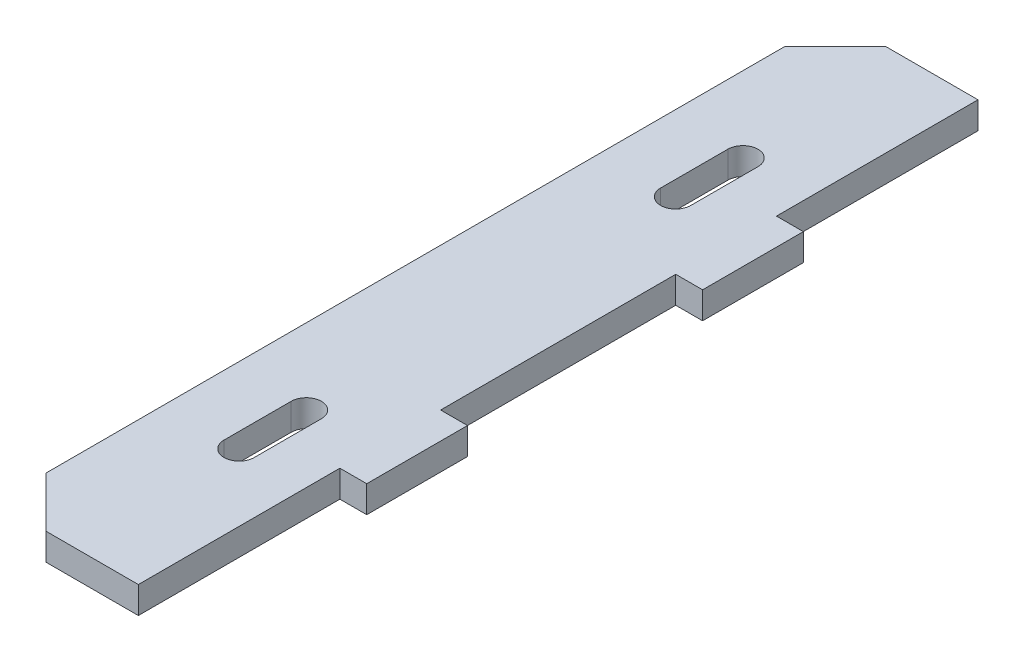
ISO-10303-21;
HEADER;
FILE_DESCRIPTION(('STEP AP214'),'2;1');
FILE_NAME('part.step','',(''),(''),'','','');
FILE_SCHEMA(('AUTOMOTIVE_DESIGN { 1 0 10303 214 1 1 1 1 }'));
ENDSEC;
DATA;
#1=APPLICATION_CONTEXT('core data for automotive mechanical design processes');
#2=APPLICATION_PROTOCOL_DEFINITION('international standard','automotive_design',2000,#1);
#3=PRODUCT_CONTEXT('',#1,'mechanical');
#4=PRODUCT('Part','Part','',(#3));
#5=PRODUCT_RELATED_PRODUCT_CATEGORY('part','',(#4));
#6=PRODUCT_DEFINITION_FORMATION('','',#4);
#7=PRODUCT_DEFINITION_CONTEXT('part definition',#1,'design');
#8=PRODUCT_DEFINITION('design','',#6,#7);
#9=PRODUCT_DEFINITION_SHAPE('','',#8);
#10=(LENGTH_UNIT() NAMED_UNIT(*) SI_UNIT(.MILLI.,.METRE.));
#11=(NAMED_UNIT(*) PLANE_ANGLE_UNIT() SI_UNIT($,.RADIAN.));
#12=(NAMED_UNIT(*) SI_UNIT($,.STERADIAN.) SOLID_ANGLE_UNIT());
#13=UNCERTAINTY_MEASURE_WITH_UNIT(LENGTH_MEASURE(1.E-05),#10,'distance_accuracy_value','');
#14=(GEOMETRIC_REPRESENTATION_CONTEXT(3) GLOBAL_UNCERTAINTY_ASSIGNED_CONTEXT((#13)) GLOBAL_UNIT_ASSIGNED_CONTEXT((#10,
#11,#12)) REPRESENTATION_CONTEXT('',''));
#15=CARTESIAN_POINT('',(0.,0.,0.));
#16=DIRECTION('',(0.,0.,1.));
#17=DIRECTION('',(1.,0.,0.));
#18=AXIS2_PLACEMENT_3D('',#15,#16,#17);
#19=CARTESIAN_POINT('',(-385.,49.5,125.));
#20=DIRECTION('',(0.,0.,-1.));
#21=DIRECTION('',(1.,0.,0.));
#22=AXIS2_PLACEMENT_3D('',#19,#20,#21);
#23=PLANE('',#22);
#24=DIRECTION('',(1.,0.,0.));
#25=VECTOR('',#24,1.);
#26=CARTESIAN_POINT('',(-385.,41.5,125.));
#27=LINE('',#26,#25);
#28=CARTESIAN_POINT('',(-370.,41.5,125.));
#29=VERTEX_POINT('',#28);
#30=CARTESIAN_POINT('',(-342.5,41.5,125.));
#31=VERTEX_POINT('',#30);
#32=EDGE_CURVE('E339',#29,#31,#27,.T.);
#33=ORIENTED_EDGE('',*,*,#32,.T.);
#34=DIRECTION('',(0.,-1.,0.));
#35=VECTOR('',#34,1.);
#36=CARTESIAN_POINT('',(-342.5,49.5,125.));
#37=LINE('',#36,#35);
#38=CARTESIAN_POINT('',(-342.5,49.5,125.));
#39=VERTEX_POINT('',#38);
#40=EDGE_CURVE('E262',#39,#31,#37,.T.);
#41=ORIENTED_EDGE('',*,*,#40,.F.);
#42=DIRECTION('',(1.,0.,0.));
#43=VECTOR('',#42,1.);
#44=CARTESIAN_POINT('',(-385.,49.5,125.));
#45=LINE('',#44,#43);
#46=CARTESIAN_POINT('',(-370.,49.5,125.));
#47=VERTEX_POINT('',#46);
#48=EDGE_CURVE('E335',#47,#39,#45,.T.);
#49=ORIENTED_EDGE('',*,*,#48,.F.);
#50=DIRECTION('',(0.,1.,0.));
#51=VECTOR('',#50,1.);
#52=CARTESIAN_POINT('',(-370.,49.5,125.));
#53=LINE('',#52,#51);
#54=EDGE_CURVE('E46',#29,#47,#53,.T.);
#55=ORIENTED_EDGE('',*,*,#54,.F.);
#56=EDGE_LOOP('',(#33,#41,#49,#55));
#57=FACE_BOUND('',#56,.T.);
#58=ADVANCED_FACE('F38',(#57),#23,.F.);
#59=CARTESIAN_POINT('',(-334.5,0.,0.));
#60=DIRECTION('',(-1.,0.,0.));
#61=DIRECTION('',(0.,0.,-1.));
#62=AXIS2_PLACEMENT_3D('',#59,#60,#61);
#63=PLANE('',#62);
#64=DIRECTION('',(0.,0.,-1.));
#65=VECTOR('',#64,1.);
#66=CARTESIAN_POINT('',(-334.5,41.5,125.));
#67=LINE('',#66,#65);
#68=CARTESIAN_POINT('',(-334.5,41.5,-35.));
#69=VERTEX_POINT('',#68);
#70=CARTESIAN_POINT('',(-334.5,41.5,-65.));
#71=VERTEX_POINT('',#70);
#72=EDGE_CURVE('E332',#69,#71,#67,.T.);
#73=ORIENTED_EDGE('',*,*,#72,.T.);
#74=DIRECTION('',(0.,-1.,0.));
#75=VECTOR('',#74,1.);
#76=CARTESIAN_POINT('',(-334.5,49.5,-65.));
#77=LINE('',#76,#75);
#78=CARTESIAN_POINT('',(-334.5,49.5,-65.));
#79=VERTEX_POINT('',#78);
#80=EDGE_CURVE('E302',#79,#71,#77,.T.);
#81=ORIENTED_EDGE('',*,*,#80,.F.);
#82=DIRECTION('',(0.,0.,-1.));
#83=VECTOR('',#82,1.);
#84=CARTESIAN_POINT('',(-334.5,49.5,125.));
#85=LINE('',#84,#83);
#86=CARTESIAN_POINT('',(-334.5,49.5,-35.));
#87=VERTEX_POINT('',#86);
#88=EDGE_CURVE('E318',#87,#79,#85,.T.);
#89=ORIENTED_EDGE('',*,*,#88,.F.);
#90=DIRECTION('',(0.,1.,0.));
#91=VECTOR('',#90,1.);
#92=CARTESIAN_POINT('',(-334.5,49.5,-35.));
#93=LINE('',#92,#91);
#94=EDGE_CURVE('E277',#69,#87,#93,.T.);
#95=ORIENTED_EDGE('',*,*,#94,.F.);
#96=EDGE_LOOP('',(#73,#81,#89,#95));
#97=FACE_BOUND('',#96,.T.);
#98=ADVANCED_FACE('F405',(#97),#63,.F.);
#99=CARTESIAN_POINT('',(-385.,49.5,125.));
#100=DIRECTION('',(0.,1.,0.));
#101=DIRECTION('',(0.,0.,1.));
#102=AXIS2_PLACEMENT_3D('',#99,#100,#101);
#103=PLANE('',#102);
#104=CARTESIAN_POINT('',(-362.5,49.5,75.));
#105=DIRECTION('',(0.,-1.,0.));
#106=DIRECTION('',(0.,0.,-1.));
#107=AXIS2_PLACEMENT_3D('',#104,#105,#106);
#108=CIRCLE('',#107,4.5);
#109=CARTESIAN_POINT('',(-358.,49.5,75.));
#110=VERTEX_POINT('',#109);
#111=CARTESIAN_POINT('',(-367.,49.5,75.));
#112=VERTEX_POINT('',#111);
#113=EDGE_CURVE('E212',#110,#112,#108,.T.);
#114=ORIENTED_EDGE('',*,*,#113,.T.);
#115=DIRECTION('',(0.,0.,-1.));
#116=VECTOR('',#115,1.);
#117=CARTESIAN_POINT('',(-367.,49.5,75.));
#118=LINE('',#117,#116);
#119=CARTESIAN_POINT('',(-367.,49.5,55.));
#120=VERTEX_POINT('',#119);
#121=EDGE_CURVE('E192',#112,#120,#118,.T.);
#122=ORIENTED_EDGE('',*,*,#121,.T.);
#123=CARTESIAN_POINT('',(-362.5,49.5,55.));
#124=DIRECTION('',(0.,-1.,0.));
#125=DIRECTION('',(0.,0.,-1.));
#126=AXIS2_PLACEMENT_3D('',#123,#124,#125);
#127=CIRCLE('',#126,4.5);
#128=CARTESIAN_POINT('',(-358.,49.5,55.));
#129=VERTEX_POINT('',#128);
#130=EDGE_CURVE('E215',#120,#129,#127,.T.);
#131=ORIENTED_EDGE('',*,*,#130,.T.);
#132=DIRECTION('',(0.,0.,1.));
#133=VECTOR('',#132,1.);
#134=CARTESIAN_POINT('',(-358.,49.5,75.));
#135=LINE('',#134,#133);
#136=EDGE_CURVE('E203',#129,#110,#135,.T.);
#137=ORIENTED_EDGE('',*,*,#136,.T.);
#138=EDGE_LOOP('',(#114,#122,#131,#137));
#139=FACE_BOUND('',#138,.T.);
#140=CARTESIAN_POINT('',(-362.5,49.5,-75.));
#141=DIRECTION('',(0.,-1.,0.));
#142=DIRECTION('',(0.,0.,1.));
#143=AXIS2_PLACEMENT_3D('',#140,#141,#142);
#144=CIRCLE('',#143,4.5);
#145=CARTESIAN_POINT('',(-367.,49.5,-75.));
#146=VERTEX_POINT('',#145);
#147=CARTESIAN_POINT('',(-358.,49.5,-75.));
#148=VERTEX_POINT('',#147);
#149=EDGE_CURVE('E221',#146,#148,#144,.T.);
#150=ORIENTED_EDGE('',*,*,#149,.T.);
#151=DIRECTION('',(0.,0.,1.));
#152=VECTOR('',#151,1.);
#153=CARTESIAN_POINT('',(-358.,49.5,-75.));
#154=LINE('',#153,#152);
#155=CARTESIAN_POINT('',(-358.,49.5,-55.));
#156=VERTEX_POINT('',#155);
#157=EDGE_CURVE('E241',#148,#156,#154,.T.);
#158=ORIENTED_EDGE('',*,*,#157,.T.);
#159=CARTESIAN_POINT('',(-362.5,49.5,-55.));
#160=DIRECTION('',(0.,-1.,0.));
#161=DIRECTION('',(0.,0.,1.));
#162=AXIS2_PLACEMENT_3D('',#159,#160,#161);
#163=CIRCLE('',#162,4.5);
#164=CARTESIAN_POINT('',(-367.,49.5,-55.));
#165=VERTEX_POINT('',#164);
#166=EDGE_CURVE('E244',#156,#165,#163,.T.);
#167=ORIENTED_EDGE('',*,*,#166,.T.);
#168=DIRECTION('',(0.,0.,-1.));
#169=VECTOR('',#168,1.);
#170=CARTESIAN_POINT('',(-367.,49.5,-75.));
#171=LINE('',#170,#169);
#172=EDGE_CURVE('E229',#165,#146,#171,.T.);
#173=ORIENTED_EDGE('',*,*,#172,.T.);
#174=EDGE_LOOP('',(#150,#158,#167,#173));
#175=FACE_BOUND('',#174,.T.);
#176=ORIENTED_EDGE('',*,*,#48,.T.);
#177=DIRECTION('',(0.,0.,1.));
#178=VECTOR('',#177,1.);
#179=CARTESIAN_POINT('',(-342.5,49.5,125.));
#180=LINE('',#179,#178);
#181=CARTESIAN_POINT('',(-342.5,49.5,65.));
#182=VERTEX_POINT('',#181);
#183=EDGE_CURVE('E251',#182,#39,#180,.T.);
#184=ORIENTED_EDGE('',*,*,#183,.F.);
#185=DIRECTION('',(-1.,0.,0.));
#186=VECTOR('',#185,1.);
#187=CARTESIAN_POINT('',(-334.5,49.5,65.));
#188=LINE('',#187,#186);
#189=CARTESIAN_POINT('',(-334.5,49.5,65.));
#190=VERTEX_POINT('',#189);
#191=EDGE_CURVE('E269',#190,#182,#188,.T.);
#192=ORIENTED_EDGE('',*,*,#191,.F.);
#193=CARTESIAN_POINT('',(-334.5,49.5,35.));
#194=VERTEX_POINT('',#193);
#195=EDGE_CURVE('E329',#190,#194,#85,.T.);
#196=ORIENTED_EDGE('',*,*,#195,.T.);
#197=DIRECTION('',(-1.,0.,0.));
#198=VECTOR('',#197,1.);
#199=CARTESIAN_POINT('',(-334.5,49.5,35.));
#200=LINE('',#199,#198);
#201=CARTESIAN_POINT('',(-342.5,49.5,35.));
#202=VERTEX_POINT('',#201);
#203=EDGE_CURVE('E281',#194,#202,#200,.T.);
#204=ORIENTED_EDGE('',*,*,#203,.T.);
#205=DIRECTION('',(0.,0.,1.));
#206=VECTOR('',#205,1.);
#207=CARTESIAN_POINT('',(-342.5,49.5,35.));
#208=LINE('',#207,#206);
#209=CARTESIAN_POINT('',(-342.5,49.5,-35.));
#210=VERTEX_POINT('',#209);
#211=EDGE_CURVE('E272',#210,#202,#208,.T.);
#212=ORIENTED_EDGE('',*,*,#211,.F.);
#213=DIRECTION('',(-1.,0.,0.));
#214=VECTOR('',#213,1.);
#215=CARTESIAN_POINT('',(-334.5,49.5,-35.));
#216=LINE('',#215,#214);
#217=EDGE_CURVE('E290',#87,#210,#216,.T.);
#218=ORIENTED_EDGE('',*,*,#217,.F.);
#219=ORIENTED_EDGE('',*,*,#88,.T.);
#220=DIRECTION('',(-1.,0.,0.));
#221=VECTOR('',#220,1.);
#222=CARTESIAN_POINT('',(-334.5,49.5,-65.));
#223=LINE('',#222,#221);
#224=CARTESIAN_POINT('',(-342.5,49.5,-65.));
#225=VERTEX_POINT('',#224);
#226=EDGE_CURVE('E305',#79,#225,#223,.T.);
#227=ORIENTED_EDGE('',*,*,#226,.T.);
#228=DIRECTION('',(0.,0.,1.));
#229=VECTOR('',#228,1.);
#230=CARTESIAN_POINT('',(-342.5,49.5,-125.));
#231=LINE('',#230,#229);
#232=CARTESIAN_POINT('',(-342.5,49.5,-125.));
#233=VERTEX_POINT('',#232);
#234=EDGE_CURVE('E293',#233,#225,#231,.T.);
#235=ORIENTED_EDGE('',*,*,#234,.F.);
#236=DIRECTION('',(1.,0.,0.));
#237=VECTOR('',#236,1.);
#238=CARTESIAN_POINT('',(-385.,49.5,-125.));
#239=LINE('',#238,#237);
#240=CARTESIAN_POINT('',(-370.,49.5,-125.));
#241=VERTEX_POINT('',#240);
#242=EDGE_CURVE('E328',#241,#233,#239,.T.);
#243=ORIENTED_EDGE('',*,*,#242,.F.);
#244=DIRECTION('',(0.707106781186548,0.,-0.707106781186547));
#245=VECTOR('',#244,1.);
#246=CARTESIAN_POINT('',(-502.5,49.5,7.4999999999999));
#247=LINE('',#246,#245);
#248=CARTESIAN_POINT('',(-385.,49.5,-110.));
#249=VERTEX_POINT('',#248);
#250=EDGE_CURVE('E348',#249,#241,#247,.T.);
#251=ORIENTED_EDGE('',*,*,#250,.F.);
#252=DIRECTION('',(0.,0.,-1.));
#253=VECTOR('',#252,1.);
#254=CARTESIAN_POINT('',(-385.,49.5,125.));
#255=LINE('',#254,#253);
#256=CARTESIAN_POINT('',(-385.,49.5,110.));
#257=VERTEX_POINT('',#256);
#258=EDGE_CURVE('E321',#257,#249,#255,.T.);
#259=ORIENTED_EDGE('',*,*,#258,.F.);
#260=DIRECTION('',(-0.707106781186548,0.,-0.707106781186547));
#261=VECTOR('',#260,1.);
#262=CARTESIAN_POINT('',(-377.5,49.5,117.5));
#263=LINE('',#262,#261);
#264=EDGE_CURVE('E11',#47,#257,#263,.T.);
#265=ORIENTED_EDGE('',*,*,#264,.F.);
#266=EDGE_LOOP('',(#176,#184,#192,#196,#204,#212,#218,#219,#227,#235,#243,#251,#259,#265));
#267=FACE_BOUND('',#266,.T.);
#268=ADVANCED_FACE('F370',(#139,#175,#267),#103,.T.);
#269=CARTESIAN_POINT('',(-385.,41.5,125.));
#270=DIRECTION('',(0.,1.,0.));
#271=DIRECTION('',(0.,0.,1.));
#272=AXIS2_PLACEMENT_3D('',#269,#270,#271);
#273=PLANE('',#272);
#274=DIRECTION('',(0.,0.,1.));
#275=VECTOR('',#274,1.);
#276=CARTESIAN_POINT('',(-358.,41.5,75.));
#277=LINE('',#276,#275);
#278=CARTESIAN_POINT('',(-358.,41.5,55.));
#279=VERTEX_POINT('',#278);
#280=CARTESIAN_POINT('',(-358.,41.5,75.));
#281=VERTEX_POINT('',#280);
#282=EDGE_CURVE('E194',#279,#281,#277,.T.);
#283=ORIENTED_EDGE('',*,*,#282,.F.);
#284=CARTESIAN_POINT('',(-362.5,41.5,55.));
#285=DIRECTION('',(0.,-1.,0.));
#286=DIRECTION('',(0.,0.,-1.));
#287=AXIS2_PLACEMENT_3D('',#284,#285,#286);
#288=CIRCLE('',#287,4.5);
#289=CARTESIAN_POINT('',(-367.,41.5,55.));
#290=VERTEX_POINT('',#289);
#291=EDGE_CURVE('E207',#290,#279,#288,.T.);
#292=ORIENTED_EDGE('',*,*,#291,.F.);
#293=DIRECTION('',(0.,0.,-1.));
#294=VECTOR('',#293,1.);
#295=CARTESIAN_POINT('',(-367.,41.5,75.));
#296=LINE('',#295,#294);
#297=CARTESIAN_POINT('',(-367.,41.5,75.));
#298=VERTEX_POINT('',#297);
#299=EDGE_CURVE('E189',#298,#290,#296,.T.);
#300=ORIENTED_EDGE('',*,*,#299,.F.);
#301=CARTESIAN_POINT('',(-362.5,41.5,75.));
#302=DIRECTION('',(0.,-1.,0.));
#303=DIRECTION('',(0.,0.,-1.));
#304=AXIS2_PLACEMENT_3D('',#301,#302,#303);
#305=CIRCLE('',#304,4.5);
#306=EDGE_CURVE('E197',#281,#298,#305,.T.);
#307=ORIENTED_EDGE('',*,*,#306,.F.);
#308=EDGE_LOOP('',(#283,#292,#300,#307));
#309=FACE_BOUND('',#308,.T.);
#310=DIRECTION('',(0.,0.,-1.));
#311=VECTOR('',#310,1.);
#312=CARTESIAN_POINT('',(-367.,41.5,-75.));
#313=LINE('',#312,#311);
#314=CARTESIAN_POINT('',(-367.,41.5,-55.));
#315=VERTEX_POINT('',#314);
#316=CARTESIAN_POINT('',(-367.,41.5,-75.));
#317=VERTEX_POINT('',#316);
#318=EDGE_CURVE('E235',#315,#317,#313,.T.);
#319=ORIENTED_EDGE('',*,*,#318,.F.);
#320=CARTESIAN_POINT('',(-362.5,41.5,-55.));
#321=DIRECTION('',(0.,-1.,0.));
#322=DIRECTION('',(0.,0.,1.));
#323=AXIS2_PLACEMENT_3D('',#320,#321,#322);
#324=CIRCLE('',#323,4.5);
#325=CARTESIAN_POINT('',(-358.,41.5,-55.));
#326=VERTEX_POINT('',#325);
#327=EDGE_CURVE('E232',#326,#315,#324,.T.);
#328=ORIENTED_EDGE('',*,*,#327,.F.);
#329=DIRECTION('',(0.,0.,1.));
#330=VECTOR('',#329,1.);
#331=CARTESIAN_POINT('',(-358.,41.5,-75.));
#332=LINE('',#331,#330);
#333=CARTESIAN_POINT('',(-358.,41.5,-75.));
#334=VERTEX_POINT('',#333);
#335=EDGE_CURVE('E228',#334,#326,#332,.T.);
#336=ORIENTED_EDGE('',*,*,#335,.F.);
#337=CARTESIAN_POINT('',(-362.5,41.5,-75.));
#338=DIRECTION('',(0.,-1.,0.));
#339=DIRECTION('',(0.,0.,1.));
#340=AXIS2_PLACEMENT_3D('',#337,#338,#339);
#341=CIRCLE('',#340,4.5);
#342=EDGE_CURVE('E225',#317,#334,#341,.T.);
#343=ORIENTED_EDGE('',*,*,#342,.F.);
#344=EDGE_LOOP('',(#319,#328,#336,#343));
#345=FACE_BOUND('',#344,.T.);
#346=DIRECTION('',(0.,0.,-1.));
#347=VECTOR('',#346,1.);
#348=CARTESIAN_POINT('',(-385.,41.5,125.));
#349=LINE('',#348,#347);
#350=CARTESIAN_POINT('',(-385.,41.5,110.));
#351=VERTEX_POINT('',#350);
#352=CARTESIAN_POINT('',(-385.,41.5,-110.));
#353=VERTEX_POINT('',#352);
#354=EDGE_CURVE('E324',#351,#353,#349,.T.);
#355=ORIENTED_EDGE('',*,*,#354,.T.);
#356=DIRECTION('',(-0.707106781186548,0.,0.707106781186547));
#357=VECTOR('',#356,1.);
#358=CARTESIAN_POINT('',(-385.,41.5,-110.));
#359=LINE('',#358,#357);
#360=CARTESIAN_POINT('',(-370.,41.5,-125.));
#361=VERTEX_POINT('',#360);
#362=EDGE_CURVE('E353',#361,#353,#359,.T.);
#363=ORIENTED_EDGE('',*,*,#362,.F.);
#364=DIRECTION('',(1.,0.,0.));
#365=VECTOR('',#364,1.);
#366=CARTESIAN_POINT('',(-385.,41.5,-125.));
#367=LINE('',#366,#365);
#368=CARTESIAN_POINT('',(-342.5,41.5,-125.));
#369=VERTEX_POINT('',#368);
#370=EDGE_CURVE('E342',#361,#369,#367,.T.);
#371=ORIENTED_EDGE('',*,*,#370,.T.);
#372=DIRECTION('',(0.,0.,-1.));
#373=VECTOR('',#372,1.);
#374=CARTESIAN_POINT('',(-342.5,41.5,-125.));
#375=LINE('',#374,#373);
#376=CARTESIAN_POINT('',(-342.5,41.5,-65.));
#377=VERTEX_POINT('',#376);
#378=EDGE_CURVE('E311',#377,#369,#375,.T.);
#379=ORIENTED_EDGE('',*,*,#378,.F.);
#380=DIRECTION('',(-1.,0.,0.));
#381=VECTOR('',#380,1.);
#382=CARTESIAN_POINT('',(-334.5,41.5,-65.));
#383=LINE('',#382,#381);
#384=EDGE_CURVE('E315',#71,#377,#383,.T.);
#385=ORIENTED_EDGE('',*,*,#384,.F.);
#386=ORIENTED_EDGE('',*,*,#72,.F.);
#387=DIRECTION('',(-1.,0.,0.));
#388=VECTOR('',#387,1.);
#389=CARTESIAN_POINT('',(-334.5,41.5,-35.));
#390=LINE('',#389,#388);
#391=CARTESIAN_POINT('',(-342.5,41.5,-35.));
#392=VERTEX_POINT('',#391);
#393=EDGE_CURVE('E294',#69,#392,#390,.T.);
#394=ORIENTED_EDGE('',*,*,#393,.T.);
#395=DIRECTION('',(0.,0.,-1.));
#396=VECTOR('',#395,1.);
#397=CARTESIAN_POINT('',(-342.5,41.5,35.));
#398=LINE('',#397,#396);
#399=CARTESIAN_POINT('',(-342.5,41.5,35.));
#400=VERTEX_POINT('',#399);
#401=EDGE_CURVE('E286',#400,#392,#398,.T.);
#402=ORIENTED_EDGE('',*,*,#401,.F.);
#403=DIRECTION('',(-1.,0.,0.));
#404=VECTOR('',#403,1.);
#405=CARTESIAN_POINT('',(-334.5,41.5,35.));
#406=LINE('',#405,#404);
#407=CARTESIAN_POINT('',(-334.5,41.5,35.));
#408=VERTEX_POINT('',#407);
#409=EDGE_CURVE('E297',#408,#400,#406,.T.);
#410=ORIENTED_EDGE('',*,*,#409,.F.);
#411=CARTESIAN_POINT('',(-334.5,41.5,65.));
#412=VERTEX_POINT('',#411);
#413=EDGE_CURVE('E325',#412,#408,#67,.T.);
#414=ORIENTED_EDGE('',*,*,#413,.F.);
#415=DIRECTION('',(-1.,0.,0.));
#416=VECTOR('',#415,1.);
#417=CARTESIAN_POINT('',(-334.5,41.5,65.));
#418=LINE('',#417,#416);
#419=CARTESIAN_POINT('',(-342.5,41.5,65.));
#420=VERTEX_POINT('',#419);
#421=EDGE_CURVE('E259',#412,#420,#418,.T.);
#422=ORIENTED_EDGE('',*,*,#421,.T.);
#423=DIRECTION('',(0.,0.,-1.));
#424=VECTOR('',#423,1.);
#425=CARTESIAN_POINT('',(-342.5,41.5,125.));
#426=LINE('',#425,#424);
#427=EDGE_CURVE('E265',#31,#420,#426,.T.);
#428=ORIENTED_EDGE('',*,*,#427,.F.);
#429=ORIENTED_EDGE('',*,*,#32,.F.);
#430=DIRECTION('',(0.707106781186548,0.,0.707106781186547));
#431=VECTOR('',#430,1.);
#432=CARTESIAN_POINT('',(-385.,41.5,110.));
#433=LINE('',#432,#431);
#434=EDGE_CURVE('E358',#351,#29,#433,.T.);
#435=ORIENTED_EDGE('',*,*,#434,.F.);
#436=EDGE_LOOP('',(#355,#363,#371,#379,#385,#386,#394,#402,#410,#414,#422,#428,#429,#435));
#437=FACE_BOUND('',#436,.T.);
#438=ADVANCED_FACE('F205',(#309,#345,#437),#273,.F.);
#439=CARTESIAN_POINT('',(-385.,41.5,-125.));
#440=DIRECTION('',(0.,0.,1.));
#441=DIRECTION('',(-1.,0.,0.));
#442=AXIS2_PLACEMENT_3D('',#439,#440,#441);
#443=PLANE('',#442);
#444=ORIENTED_EDGE('',*,*,#242,.T.);
#445=DIRECTION('',(0.,1.,0.));
#446=VECTOR('',#445,1.);
#447=CARTESIAN_POINT('',(-342.5,49.5,-125.));
#448=LINE('',#447,#446);
#449=EDGE_CURVE('E306',#369,#233,#448,.T.);
#450=ORIENTED_EDGE('',*,*,#449,.F.);
#451=ORIENTED_EDGE('',*,*,#370,.F.);
#452=DIRECTION('',(0.,-1.,0.));
#453=VECTOR('',#452,1.);
#454=CARTESIAN_POINT('',(-370.,41.5,-125.));
#455=LINE('',#454,#453);
#456=EDGE_CURVE('E351',#241,#361,#455,.T.);
#457=ORIENTED_EDGE('',*,*,#456,.F.);
#458=EDGE_LOOP('',(#444,#450,#451,#457));
#459=FACE_BOUND('',#458,.T.);
#460=ADVANCED_FACE('F414',(#459),#443,.F.);
#461=CARTESIAN_POINT('',(-385.,0.,0.));
#462=DIRECTION('',(-1.,0.,0.));
#463=DIRECTION('',(0.,0.,-1.));
#464=AXIS2_PLACEMENT_3D('',#461,#462,#463);
#465=PLANE('',#464);
#466=ORIENTED_EDGE('',*,*,#258,.T.);
#467=DIRECTION('',(0.,1.,0.));
#468=VECTOR('',#467,1.);
#469=CARTESIAN_POINT('',(-385.,49.5,-110.));
#470=LINE('',#469,#468);
#471=EDGE_CURVE('E338',#353,#249,#470,.T.);
#472=ORIENTED_EDGE('',*,*,#471,.F.);
#473=ORIENTED_EDGE('',*,*,#354,.F.);
#474=DIRECTION('',(0.,-1.,0.));
#475=VECTOR('',#474,1.);
#476=CARTESIAN_POINT('',(-385.,41.5,110.));
#477=LINE('',#476,#475);
#478=EDGE_CURVE('E356',#257,#351,#477,.T.);
#479=ORIENTED_EDGE('',*,*,#478,.F.);
#480=EDGE_LOOP('',(#466,#472,#473,#479));
#481=FACE_BOUND('',#480,.T.);
#482=ADVANCED_FACE('F375',(#481),#465,.T.);
#483=ORIENTED_EDGE('',*,*,#413,.T.);
#484=DIRECTION('',(0.,-1.,0.));
#485=VECTOR('',#484,1.);
#486=CARTESIAN_POINT('',(-334.5,49.5,35.));
#487=LINE('',#486,#485);
#488=EDGE_CURVE('E275',#194,#408,#487,.T.);
#489=ORIENTED_EDGE('',*,*,#488,.F.);
#490=ORIENTED_EDGE('',*,*,#195,.F.);
#491=DIRECTION('',(0.,1.,0.));
#492=VECTOR('',#491,1.);
#493=CARTESIAN_POINT('',(-334.5,49.5,65.));
#494=LINE('',#493,#492);
#495=EDGE_CURVE('E257',#412,#190,#494,.T.);
#496=ORIENTED_EDGE('',*,*,#495,.F.);
#497=EDGE_LOOP('',(#483,#489,#490,#496));
#498=FACE_BOUND('',#497,.T.);
#499=ADVANCED_FACE('F389',(#498),#63,.F.);
#500=CARTESIAN_POINT('',(-334.5,49.5,-65.));
#501=DIRECTION('',(0.,0.,1.));
#502=DIRECTION('',(-1.,0.,0.));
#503=AXIS2_PLACEMENT_3D('',#500,#501,#502);
#504=PLANE('',#503);
#505=DIRECTION('',(0.,-1.,0.));
#506=VECTOR('',#505,1.);
#507=CARTESIAN_POINT('',(-342.5,49.5,-65.));
#508=LINE('',#507,#506);
#509=EDGE_CURVE('E309',#225,#377,#508,.T.);
#510=ORIENTED_EDGE('',*,*,#509,.F.);
#511=ORIENTED_EDGE('',*,*,#226,.F.);
#512=ORIENTED_EDGE('',*,*,#80,.T.);
#513=ORIENTED_EDGE('',*,*,#384,.T.);
#514=EDGE_LOOP('',(#510,#511,#512,#513));
#515=FACE_BOUND('',#514,.T.);
#516=ADVANCED_FACE('F407',(#515),#504,.F.);
#517=CARTESIAN_POINT('',(-342.5,0.,0.));
#518=DIRECTION('',(-1.,0.,0.));
#519=DIRECTION('',(0.,0.,-1.));
#520=AXIS2_PLACEMENT_3D('',#517,#518,#519);
#521=PLANE('',#520);
#522=ORIENTED_EDGE('',*,*,#234,.T.);
#523=ORIENTED_EDGE('',*,*,#509,.T.);
#524=ORIENTED_EDGE('',*,*,#378,.T.);
#525=ORIENTED_EDGE('',*,*,#449,.T.);
#526=EDGE_LOOP('',(#522,#523,#524,#525));
#527=FACE_BOUND('',#526,.T.);
#528=ADVANCED_FACE('F411',(#527),#521,.F.);
#529=CARTESIAN_POINT('',(-334.5,49.5,-35.));
#530=DIRECTION('',(0.,0.,-1.));
#531=DIRECTION('',(1.,0.,0.));
#532=AXIS2_PLACEMENT_3D('',#529,#530,#531);
#533=PLANE('',#532);
#534=DIRECTION('',(0.,1.,0.));
#535=VECTOR('',#534,1.);
#536=CARTESIAN_POINT('',(-342.5,49.5,-35.));
#537=LINE('',#536,#535);
#538=EDGE_CURVE('E278',#392,#210,#537,.T.);
#539=ORIENTED_EDGE('',*,*,#538,.F.);
#540=ORIENTED_EDGE('',*,*,#393,.F.);
#541=ORIENTED_EDGE('',*,*,#94,.T.);
#542=ORIENTED_EDGE('',*,*,#217,.T.);
#543=EDGE_LOOP('',(#539,#540,#541,#542));
#544=FACE_BOUND('',#543,.T.);
#545=ADVANCED_FACE('F401',(#544),#533,.F.);
#546=CARTESIAN_POINT('',(-334.5,49.5,35.));
#547=DIRECTION('',(0.,0.,1.));
#548=DIRECTION('',(-1.,0.,0.));
#549=AXIS2_PLACEMENT_3D('',#546,#547,#548);
#550=PLANE('',#549);
#551=DIRECTION('',(0.,-1.,0.));
#552=VECTOR('',#551,1.);
#553=CARTESIAN_POINT('',(-342.5,49.5,35.));
#554=LINE('',#553,#552);
#555=EDGE_CURVE('E284',#202,#400,#554,.T.);
#556=ORIENTED_EDGE('',*,*,#555,.F.);
#557=ORIENTED_EDGE('',*,*,#203,.F.);
#558=ORIENTED_EDGE('',*,*,#488,.T.);
#559=ORIENTED_EDGE('',*,*,#409,.T.);
#560=EDGE_LOOP('',(#556,#557,#558,#559));
#561=FACE_BOUND('',#560,.T.);
#562=ADVANCED_FACE('F392',(#561),#550,.F.);
#563=CARTESIAN_POINT('',(-342.5,0.,0.));
#564=DIRECTION('',(1.,0.,0.));
#565=DIRECTION('',(0.,0.,1.));
#566=AXIS2_PLACEMENT_3D('',#563,#564,#565);
#567=PLANE('',#566);
#568=ORIENTED_EDGE('',*,*,#211,.T.);
#569=ORIENTED_EDGE('',*,*,#555,.T.);
#570=ORIENTED_EDGE('',*,*,#401,.T.);
#571=ORIENTED_EDGE('',*,*,#538,.T.);
#572=EDGE_LOOP('',(#568,#569,#570,#571));
#573=FACE_BOUND('',#572,.T.);
#574=ADVANCED_FACE('F395',(#573),#567,.T.);
#575=CARTESIAN_POINT('',(-334.5,49.5,65.));
#576=DIRECTION('',(0.,0.,-1.));
#577=DIRECTION('',(1.,0.,0.));
#578=AXIS2_PLACEMENT_3D('',#575,#576,#577);
#579=PLANE('',#578);
#580=DIRECTION('',(0.,1.,0.));
#581=VECTOR('',#580,1.);
#582=CARTESIAN_POINT('',(-342.5,49.5,65.));
#583=LINE('',#582,#581);
#584=EDGE_CURVE('E260',#420,#182,#583,.T.);
#585=ORIENTED_EDGE('',*,*,#584,.F.);
#586=ORIENTED_EDGE('',*,*,#421,.F.);
#587=ORIENTED_EDGE('',*,*,#495,.T.);
#588=ORIENTED_EDGE('',*,*,#191,.T.);
#589=EDGE_LOOP('',(#585,#586,#587,#588));
#590=FACE_BOUND('',#589,.T.);
#591=ADVANCED_FACE('F384',(#590),#579,.F.);
#592=CARTESIAN_POINT('',(-342.5,0.,0.));
#593=DIRECTION('',(1.,0.,0.));
#594=DIRECTION('',(0.,0.,1.));
#595=AXIS2_PLACEMENT_3D('',#592,#593,#594);
#596=PLANE('',#595);
#597=ORIENTED_EDGE('',*,*,#183,.T.);
#598=ORIENTED_EDGE('',*,*,#40,.T.);
#599=ORIENTED_EDGE('',*,*,#427,.T.);
#600=ORIENTED_EDGE('',*,*,#584,.T.);
#601=EDGE_LOOP('',(#597,#598,#599,#600));
#602=FACE_BOUND('',#601,.T.);
#603=ADVANCED_FACE('F382',(#602),#596,.T.);
#604=CARTESIAN_POINT('',(-385.,0.,-110.));
#605=DIRECTION('',(-0.707106781186547,0.,-0.707106781186548));
#606=DIRECTION('',(0.,-1.,0.));
#607=AXIS2_PLACEMENT_3D('',#604,#605,#606);
#608=PLANE('',#607);
#609=ORIENTED_EDGE('',*,*,#362,.T.);
#610=ORIENTED_EDGE('',*,*,#471,.T.);
#611=ORIENTED_EDGE('',*,*,#250,.T.);
#612=ORIENTED_EDGE('',*,*,#456,.T.);
#613=EDGE_LOOP('',(#609,#610,#611,#612));
#614=FACE_BOUND('',#613,.T.);
#615=ADVANCED_FACE('F416',(#614),#608,.T.);
#616=CARTESIAN_POINT('',(-385.,0.,110.));
#617=DIRECTION('',(-0.707106781186547,0.,0.707106781186548));
#618=DIRECTION('',(0.,1.,0.));
#619=AXIS2_PLACEMENT_3D('',#616,#617,#618);
#620=PLANE('',#619);
#621=ORIENTED_EDGE('',*,*,#264,.T.);
#622=ORIENTED_EDGE('',*,*,#478,.T.);
#623=ORIENTED_EDGE('',*,*,#434,.T.);
#624=ORIENTED_EDGE('',*,*,#54,.T.);
#625=EDGE_LOOP('',(#621,#622,#623,#624));
#626=FACE_BOUND('',#625,.T.);
#627=ADVANCED_FACE('F40',(#626),#620,.T.);
#628=CARTESIAN_POINT('',(-362.5,41.5,-75.));
#629=DIRECTION('',(0.,1.,0.));
#630=DIRECTION('',(0.,0.,1.));
#631=AXIS2_PLACEMENT_3D('',#628,#629,#630);
#632=CYLINDRICAL_SURFACE('',#631,4.5);
#633=ORIENTED_EDGE('',*,*,#149,.F.);
#634=DIRECTION('',(0.,1.,0.));
#635=VECTOR('',#634,1.);
#636=CARTESIAN_POINT('',(-367.,41.5,-75.));
#637=LINE('',#636,#635);
#638=EDGE_CURVE('E249',#317,#146,#637,.T.);
#639=ORIENTED_EDGE('',*,*,#638,.F.);
#640=ORIENTED_EDGE('',*,*,#342,.T.);
#641=DIRECTION('',(0.,1.,0.));
#642=VECTOR('',#641,1.);
#643=CARTESIAN_POINT('',(-358.,41.5,-75.));
#644=LINE('',#643,#642);
#645=EDGE_CURVE('E238',#334,#148,#644,.T.);
#646=ORIENTED_EDGE('',*,*,#645,.T.);
#647=EDGE_LOOP('',(#633,#639,#640,#646));
#648=FACE_BOUND('',#647,.T.);
#649=ADVANCED_FACE('F422',(#648),#632,.F.);
#650=CARTESIAN_POINT('',(-367.,41.5,-75.));
#651=DIRECTION('',(-1.,0.,0.));
#652=DIRECTION('',(0.,0.,-1.));
#653=AXIS2_PLACEMENT_3D('',#650,#651,#652);
#654=PLANE('',#653);
#655=ORIENTED_EDGE('',*,*,#172,.F.);
#656=DIRECTION('',(0.,1.,0.));
#657=VECTOR('',#656,1.);
#658=CARTESIAN_POINT('',(-367.,41.5,-55.));
#659=LINE('',#658,#657);
#660=EDGE_CURVE('E252',#315,#165,#659,.T.);
#661=ORIENTED_EDGE('',*,*,#660,.F.);
#662=ORIENTED_EDGE('',*,*,#318,.T.);
#663=ORIENTED_EDGE('',*,*,#638,.T.);
#664=EDGE_LOOP('',(#655,#661,#662,#663));
#665=FACE_BOUND('',#664,.T.);
#666=ADVANCED_FACE('F455',(#665),#654,.F.);
#667=CARTESIAN_POINT('',(-362.5,41.5,-55.));
#668=DIRECTION('',(0.,1.,0.));
#669=DIRECTION('',(0.,0.,1.));
#670=AXIS2_PLACEMENT_3D('',#667,#668,#669);
#671=CYLINDRICAL_SURFACE('',#670,4.5);
#672=ORIENTED_EDGE('',*,*,#166,.F.);
#673=DIRECTION('',(0.,1.,0.));
#674=VECTOR('',#673,1.);
#675=CARTESIAN_POINT('',(-358.,41.5,-55.));
#676=LINE('',#675,#674);
#677=EDGE_CURVE('E254',#326,#156,#676,.T.);
#678=ORIENTED_EDGE('',*,*,#677,.F.);
#679=ORIENTED_EDGE('',*,*,#327,.T.);
#680=ORIENTED_EDGE('',*,*,#660,.T.);
#681=EDGE_LOOP('',(#672,#678,#679,#680));
#682=FACE_BOUND('',#681,.T.);
#683=ADVANCED_FACE('F452',(#682),#671,.F.);
#684=CARTESIAN_POINT('',(-358.,41.5,-75.));
#685=DIRECTION('',(1.,0.,0.));
#686=DIRECTION('',(0.,0.,1.));
#687=AXIS2_PLACEMENT_3D('',#684,#685,#686);
#688=PLANE('',#687);
#689=ORIENTED_EDGE('',*,*,#157,.F.);
#690=ORIENTED_EDGE('',*,*,#645,.F.);
#691=ORIENTED_EDGE('',*,*,#335,.T.);
#692=ORIENTED_EDGE('',*,*,#677,.T.);
#693=EDGE_LOOP('',(#689,#690,#691,#692));
#694=FACE_BOUND('',#693,.T.);
#695=ADVANCED_FACE('F448',(#694),#688,.F.);
#696=CARTESIAN_POINT('',(-362.5,41.5,75.));
#697=DIRECTION('',(0.,1.,0.));
#698=DIRECTION('',(0.,0.,1.));
#699=AXIS2_PLACEMENT_3D('',#696,#697,#698);
#700=CYLINDRICAL_SURFACE('',#699,4.5);
#701=ORIENTED_EDGE('',*,*,#113,.F.);
#702=DIRECTION('',(0.,1.,0.));
#703=VECTOR('',#702,1.);
#704=CARTESIAN_POINT('',(-358.,41.5,75.));
#705=LINE('',#704,#703);
#706=EDGE_CURVE('E199',#281,#110,#705,.T.);
#707=ORIENTED_EDGE('',*,*,#706,.F.);
#708=ORIENTED_EDGE('',*,*,#306,.T.);
#709=DIRECTION('',(0.,1.,0.));
#710=VECTOR('',#709,1.);
#711=CARTESIAN_POINT('',(-367.,41.5,75.));
#712=LINE('',#711,#710);
#713=EDGE_CURVE('E53',#298,#112,#712,.T.);
#714=ORIENTED_EDGE('',*,*,#713,.T.);
#715=EDGE_LOOP('',(#701,#707,#708,#714));
#716=FACE_BOUND('',#715,.T.);
#717=ADVANCED_FACE('F198',(#716),#700,.F.);
#718=CARTESIAN_POINT('',(-358.,41.5,75.));
#719=DIRECTION('',(1.,0.,0.));
#720=DIRECTION('',(0.,0.,1.));
#721=AXIS2_PLACEMENT_3D('',#718,#719,#720);
#722=PLANE('',#721);
#723=ORIENTED_EDGE('',*,*,#136,.F.);
#724=DIRECTION('',(0.,1.,0.));
#725=VECTOR('',#724,1.);
#726=CARTESIAN_POINT('',(-358.,41.5,55.));
#727=LINE('',#726,#725);
#728=EDGE_CURVE('E222',#279,#129,#727,.T.);
#729=ORIENTED_EDGE('',*,*,#728,.F.);
#730=ORIENTED_EDGE('',*,*,#282,.T.);
#731=ORIENTED_EDGE('',*,*,#706,.T.);
#732=EDGE_LOOP('',(#723,#729,#730,#731));
#733=FACE_BOUND('',#732,.T.);
#734=ADVANCED_FACE('F557',(#733),#722,.F.);
#735=CARTESIAN_POINT('',(-362.5,41.5,55.));
#736=DIRECTION('',(0.,1.,0.));
#737=DIRECTION('',(0.,0.,1.));
#738=AXIS2_PLACEMENT_3D('',#735,#736,#737);
#739=CYLINDRICAL_SURFACE('',#738,4.5);
#740=ORIENTED_EDGE('',*,*,#130,.F.);
#741=DIRECTION('',(0.,1.,0.));
#742=VECTOR('',#741,1.);
#743=CARTESIAN_POINT('',(-367.,41.5,55.));
#744=LINE('',#743,#742);
#745=EDGE_CURVE('E61',#290,#120,#744,.T.);
#746=ORIENTED_EDGE('',*,*,#745,.F.);
#747=ORIENTED_EDGE('',*,*,#291,.T.);
#748=ORIENTED_EDGE('',*,*,#728,.T.);
#749=EDGE_LOOP('',(#740,#746,#747,#748));
#750=FACE_BOUND('',#749,.T.);
#751=ADVANCED_FACE('F565',(#750),#739,.F.);
#752=CARTESIAN_POINT('',(-367.,41.5,75.));
#753=DIRECTION('',(-1.,0.,0.));
#754=DIRECTION('',(0.,0.,-1.));
#755=AXIS2_PLACEMENT_3D('',#752,#753,#754);
#756=PLANE('',#755);
#757=ORIENTED_EDGE('',*,*,#121,.F.);
#758=ORIENTED_EDGE('',*,*,#713,.F.);
#759=ORIENTED_EDGE('',*,*,#299,.T.);
#760=ORIENTED_EDGE('',*,*,#745,.T.);
#761=EDGE_LOOP('',(#757,#758,#759,#760));
#762=FACE_BOUND('',#761,.T.);
#763=ADVANCED_FACE('F187',(#762),#756,.F.);
#764=CLOSED_SHELL('',(#58,#98,#268,#438,#460,#482,#499,#516,#528,#545,#562,#574,#591,#603,#615,
#627,#649,#666,#683,#695,#717,#734,#751,#763));
#765=MANIFOLD_SOLID_BREP('B2',#764);
#766=ADVANCED_BREP_SHAPE_REPRESENTATION('',(#18,#765),#14);
#767=SHAPE_DEFINITION_REPRESENTATION(#9,#766);
ENDSEC;
END-ISO-10303-21;
